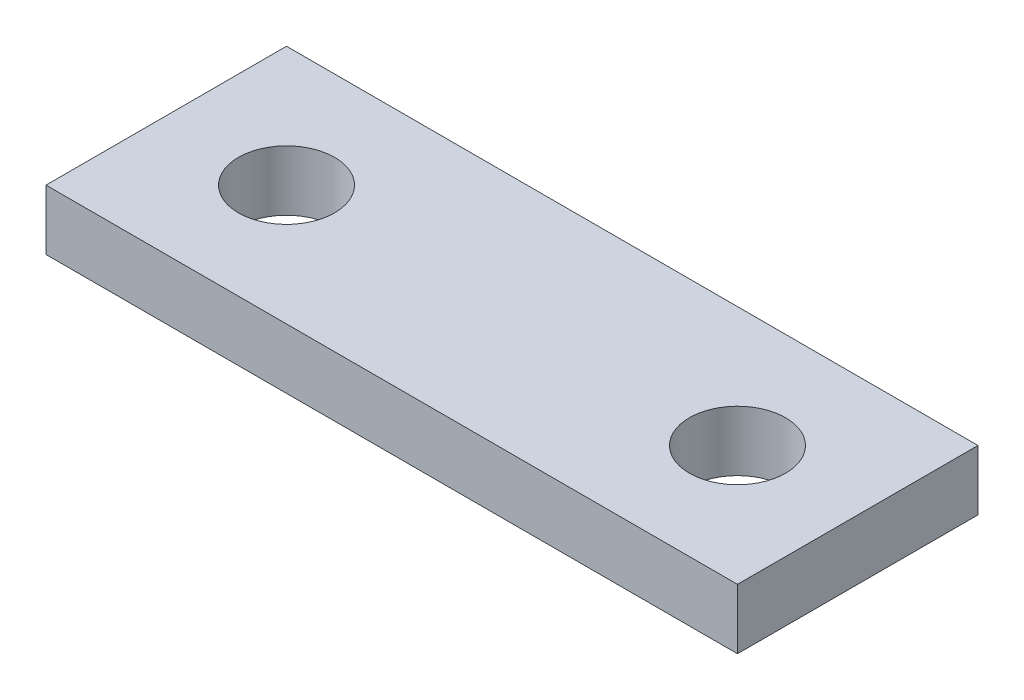
ISO-10303-21;
HEADER;
FILE_DESCRIPTION(('STEP AP214'),'2;1');
FILE_NAME('part.step','',(''),(''),'','','');
FILE_SCHEMA(('AUTOMOTIVE_DESIGN { 1 0 10303 214 1 1 1 1 }'));
ENDSEC;
DATA;
#1=APPLICATION_CONTEXT('core data for automotive mechanical design processes');
#2=APPLICATION_PROTOCOL_DEFINITION('international standard','automotive_design',2000,#1);
#3=PRODUCT_CONTEXT('',#1,'mechanical');
#4=PRODUCT('Part','Part','',(#3));
#5=PRODUCT_RELATED_PRODUCT_CATEGORY('part','',(#4));
#6=PRODUCT_DEFINITION_FORMATION('','',#4);
#7=PRODUCT_DEFINITION_CONTEXT('part definition',#1,'design');
#8=PRODUCT_DEFINITION('design','',#6,#7);
#9=PRODUCT_DEFINITION_SHAPE('','',#8);
#10=(LENGTH_UNIT() NAMED_UNIT(*) SI_UNIT(.MILLI.,.METRE.));
#11=(NAMED_UNIT(*) PLANE_ANGLE_UNIT() SI_UNIT($,.RADIAN.));
#12=(NAMED_UNIT(*) SI_UNIT($,.STERADIAN.) SOLID_ANGLE_UNIT());
#13=UNCERTAINTY_MEASURE_WITH_UNIT(LENGTH_MEASURE(1.E-05),#10,'distance_accuracy_value','');
#14=(GEOMETRIC_REPRESENTATION_CONTEXT(3) GLOBAL_UNCERTAINTY_ASSIGNED_CONTEXT((#13)) GLOBAL_UNIT_ASSIGNED_CONTEXT((#10,
#11,#12)) REPRESENTATION_CONTEXT('',''));
#15=CARTESIAN_POINT('',(0.,0.,0.));
#16=DIRECTION('',(0.,0.,1.));
#17=DIRECTION('',(1.,0.,0.));
#18=AXIS2_PLACEMENT_3D('',#15,#16,#17);
#19=CARTESIAN_POINT('',(-11.5,2.,4.));
#20=DIRECTION('',(1.,0.,0.));
#21=DIRECTION('',(0.,0.,-1.));
#22=AXIS2_PLACEMENT_3D('',#19,#20,#21);
#23=PLANE('',#22);
#24=DIRECTION('',(0.,0.,1.));
#25=VECTOR('',#24,1.);
#26=CARTESIAN_POINT('',(-11.5,0.,4.));
#27=LINE('',#26,#25);
#28=CARTESIAN_POINT('',(-11.5,0.,-4.));
#29=VERTEX_POINT('',#28);
#30=CARTESIAN_POINT('',(-11.5,0.,4.));
#31=VERTEX_POINT('',#30);
#32=EDGE_CURVE('E98',#29,#31,#27,.T.);
#33=ORIENTED_EDGE('',*,*,#32,.T.);
#34=DIRECTION('',(0.,-1.,0.));
#35=VECTOR('',#34,1.);
#36=CARTESIAN_POINT('',(-11.5,2.,4.));
#37=LINE('',#36,#35);
#38=CARTESIAN_POINT('',(-11.5,2.,4.));
#39=VERTEX_POINT('',#38);
#40=EDGE_CURVE('E11',#39,#31,#37,.T.);
#41=ORIENTED_EDGE('',*,*,#40,.F.);
#42=DIRECTION('',(0.,0.,1.));
#43=VECTOR('',#42,1.);
#44=CARTESIAN_POINT('',(-11.5,2.,4.));
#45=LINE('',#44,#43);
#46=CARTESIAN_POINT('',(-11.5,2.,-4.));
#47=VERTEX_POINT('',#46);
#48=EDGE_CURVE('E86',#47,#39,#45,.T.);
#49=ORIENTED_EDGE('',*,*,#48,.F.);
#50=DIRECTION('',(0.,-1.,0.));
#51=VECTOR('',#50,1.);
#52=CARTESIAN_POINT('',(-11.5,2.,-4.));
#53=LINE('',#52,#51);
#54=EDGE_CURVE('E94',#47,#29,#53,.T.);
#55=ORIENTED_EDGE('',*,*,#54,.T.);
#56=EDGE_LOOP('',(#33,#41,#49,#55));
#57=FACE_BOUND('',#56,.T.);
#58=ADVANCED_FACE('F35',(#57),#23,.F.);
#59=CARTESIAN_POINT('',(11.5,2.,4.));
#60=DIRECTION('',(0.,0.,-1.));
#61=DIRECTION('',(-1.,0.,0.));
#62=AXIS2_PLACEMENT_3D('',#59,#60,#61);
#63=PLANE('',#62);
#64=DIRECTION('',(1.,0.,0.));
#65=VECTOR('',#64,1.);
#66=CARTESIAN_POINT('',(11.5,0.,4.));
#67=LINE('',#66,#65);
#68=CARTESIAN_POINT('',(11.5,0.,4.));
#69=VERTEX_POINT('',#68);
#70=EDGE_CURVE('E90',#31,#69,#67,.T.);
#71=ORIENTED_EDGE('',*,*,#70,.T.);
#72=DIRECTION('',(0.,-1.,0.));
#73=VECTOR('',#72,1.);
#74=CARTESIAN_POINT('',(11.5,2.,4.));
#75=LINE('',#74,#73);
#76=CARTESIAN_POINT('',(11.5,2.,4.));
#77=VERTEX_POINT('',#76);
#78=EDGE_CURVE('E43',#77,#69,#75,.T.);
#79=ORIENTED_EDGE('',*,*,#78,.F.);
#80=DIRECTION('',(1.,0.,0.));
#81=VECTOR('',#80,1.);
#82=CARTESIAN_POINT('',(11.5,2.,4.));
#83=LINE('',#82,#81);
#84=EDGE_CURVE('E81',#39,#77,#83,.T.);
#85=ORIENTED_EDGE('',*,*,#84,.F.);
#86=ORIENTED_EDGE('',*,*,#40,.T.);
#87=EDGE_LOOP('',(#71,#79,#85,#86));
#88=FACE_BOUND('',#87,.T.);
#89=ADVANCED_FACE('F89',(#88),#63,.F.);
#90=CARTESIAN_POINT('',(11.5,2.,4.));
#91=DIRECTION('',(-1.,0.,0.));
#92=DIRECTION('',(0.,0.,1.));
#93=AXIS2_PLACEMENT_3D('',#90,#91,#92);
#94=PLANE('',#93);
#95=DIRECTION('',(0.,0.,-1.));
#96=VECTOR('',#95,1.);
#97=CARTESIAN_POINT('',(11.5,0.,4.));
#98=LINE('',#97,#96);
#99=CARTESIAN_POINT('',(11.5,0.,-4.));
#100=VERTEX_POINT('',#99);
#101=EDGE_CURVE('E68',#69,#100,#98,.T.);
#102=ORIENTED_EDGE('',*,*,#101,.T.);
#103=DIRECTION('',(0.,-1.,0.));
#104=VECTOR('',#103,1.);
#105=CARTESIAN_POINT('',(11.5,2.,-4.));
#106=LINE('',#105,#104);
#107=CARTESIAN_POINT('',(11.5,2.,-4.));
#108=VERTEX_POINT('',#107);
#109=EDGE_CURVE('E91',#108,#100,#106,.T.);
#110=ORIENTED_EDGE('',*,*,#109,.F.);
#111=DIRECTION('',(0.,0.,-1.));
#112=VECTOR('',#111,1.);
#113=CARTESIAN_POINT('',(11.5,2.,4.));
#114=LINE('',#113,#112);
#115=EDGE_CURVE('E84',#77,#108,#114,.T.);
#116=ORIENTED_EDGE('',*,*,#115,.F.);
#117=ORIENTED_EDGE('',*,*,#78,.T.);
#118=EDGE_LOOP('',(#102,#110,#116,#117));
#119=FACE_BOUND('',#118,.T.);
#120=ADVANCED_FACE('F92',(#119),#94,.F.);
#121=CARTESIAN_POINT('',(11.5,2.,-4.));
#122=DIRECTION('',(0.,0.,1.));
#123=DIRECTION('',(1.,0.,0.));
#124=AXIS2_PLACEMENT_3D('',#121,#122,#123);
#125=PLANE('',#124);
#126=DIRECTION('',(-1.,0.,0.));
#127=VECTOR('',#126,1.);
#128=CARTESIAN_POINT('',(11.5,0.,-4.));
#129=LINE('',#128,#127);
#130=EDGE_CURVE('E74',#100,#29,#129,.T.);
#131=ORIENTED_EDGE('',*,*,#130,.T.);
#132=ORIENTED_EDGE('',*,*,#54,.F.);
#133=DIRECTION('',(-1.,0.,0.));
#134=VECTOR('',#133,1.);
#135=CARTESIAN_POINT('',(11.5,2.,-4.));
#136=LINE('',#135,#134);
#137=EDGE_CURVE('E51',#108,#47,#136,.T.);
#138=ORIENTED_EDGE('',*,*,#137,.F.);
#139=ORIENTED_EDGE('',*,*,#109,.T.);
#140=EDGE_LOOP('',(#131,#132,#138,#139));
#141=FACE_BOUND('',#140,.T.);
#142=ADVANCED_FACE('F106',(#141),#125,.F.);
#143=CARTESIAN_POINT('',(0.,2.,0.));
#144=DIRECTION('',(0.,1.,0.));
#145=DIRECTION('',(0.,0.,1.));
#146=AXIS2_PLACEMENT_3D('',#143,#144,#145);
#147=PLANE('',#146);
#148=CARTESIAN_POINT('',(-7.5,2.,0.));
#149=DIRECTION('',(0.,1.,0.));
#150=DIRECTION('',(0.,0.,1.));
#151=AXIS2_PLACEMENT_3D('',#148,#149,#150);
#152=CIRCLE('',#151,1.6);
#153=CARTESIAN_POINT('',(-7.5,2.,1.6));
#154=VERTEX_POINT('',#153);
#155=EDGE_CURVE('E118',#154,#154,#152,.T.);
#156=ORIENTED_EDGE('',*,*,#155,.F.);
#157=EDGE_LOOP('',(#156));
#158=FACE_BOUND('',#157,.T.);
#159=CARTESIAN_POINT('',(7.5,2.,0.));
#160=DIRECTION('',(0.,1.,0.));
#161=DIRECTION('',(0.,0.,1.));
#162=AXIS2_PLACEMENT_3D('',#159,#160,#161);
#163=CIRCLE('',#162,1.6);
#164=CARTESIAN_POINT('',(7.5,2.,1.6));
#165=VERTEX_POINT('',#164);
#166=EDGE_CURVE('E112',#165,#165,#163,.T.);
#167=ORIENTED_EDGE('',*,*,#166,.F.);
#168=EDGE_LOOP('',(#167));
#169=FACE_BOUND('',#168,.T.);
#170=ORIENTED_EDGE('',*,*,#48,.T.);
#171=ORIENTED_EDGE('',*,*,#84,.T.);
#172=ORIENTED_EDGE('',*,*,#115,.T.);
#173=ORIENTED_EDGE('',*,*,#137,.T.);
#174=EDGE_LOOP('',(#170,#171,#172,#173));
#175=FACE_BOUND('',#174,.T.);
#176=ADVANCED_FACE('F82',(#158,#169,#175),#147,.T.);
#177=CARTESIAN_POINT('',(0.,0.,0.));
#178=DIRECTION('',(0.,1.,0.));
#179=DIRECTION('',(0.,0.,1.));
#180=AXIS2_PLACEMENT_3D('',#177,#178,#179);
#181=PLANE('',#180);
#182=CARTESIAN_POINT('',(-7.5,0.,0.));
#183=DIRECTION('',(0.,1.,0.));
#184=DIRECTION('',(0.,0.,1.));
#185=AXIS2_PLACEMENT_3D('',#182,#183,#184);
#186=CIRCLE('',#185,1.6);
#187=CARTESIAN_POINT('',(-7.5,0.,1.6));
#188=VERTEX_POINT('',#187);
#189=EDGE_CURVE('E101',#188,#188,#186,.T.);
#190=ORIENTED_EDGE('',*,*,#189,.T.);
#191=EDGE_LOOP('',(#190));
#192=FACE_BOUND('',#191,.T.);
#193=CARTESIAN_POINT('',(7.5,0.,0.));
#194=DIRECTION('',(0.,1.,0.));
#195=DIRECTION('',(0.,0.,1.));
#196=AXIS2_PLACEMENT_3D('',#193,#194,#195);
#197=CIRCLE('',#196,1.6);
#198=CARTESIAN_POINT('',(7.5,0.,1.6));
#199=VERTEX_POINT('',#198);
#200=EDGE_CURVE('E115',#199,#199,#197,.T.);
#201=ORIENTED_EDGE('',*,*,#200,.T.);
#202=EDGE_LOOP('',(#201));
#203=FACE_BOUND('',#202,.T.);
#204=ORIENTED_EDGE('',*,*,#32,.F.);
#205=ORIENTED_EDGE('',*,*,#130,.F.);
#206=ORIENTED_EDGE('',*,*,#101,.F.);
#207=ORIENTED_EDGE('',*,*,#70,.F.);
#208=EDGE_LOOP('',(#204,#205,#206,#207));
#209=FACE_BOUND('',#208,.T.);
#210=ADVANCED_FACE('F109',(#192,#203,#209),#181,.F.);
#211=CARTESIAN_POINT('',(7.5,0.,0.));
#212=DIRECTION('',(0.,1.,0.));
#213=DIRECTION('',(0.,0.,1.));
#214=AXIS2_PLACEMENT_3D('',#211,#212,#213);
#215=CYLINDRICAL_SURFACE('',#214,1.6);
#216=ORIENTED_EDGE('',*,*,#200,.F.);
#217=EDGE_LOOP('',(#216));
#218=FACE_BOUND('',#217,.T.);
#219=ORIENTED_EDGE('',*,*,#166,.T.);
#220=EDGE_LOOP('',(#219));
#221=FACE_BOUND('',#220,.T.);
#222=ADVANCED_FACE('F129',(#218,#221),#215,.F.);
#223=CARTESIAN_POINT('',(-7.5,0.,0.));
#224=DIRECTION('',(0.,1.,0.));
#225=DIRECTION('',(0.,0.,1.));
#226=AXIS2_PLACEMENT_3D('',#223,#224,#225);
#227=CYLINDRICAL_SURFACE('',#226,1.6);
#228=ORIENTED_EDGE('',*,*,#189,.F.);
#229=EDGE_LOOP('',(#228));
#230=FACE_BOUND('',#229,.T.);
#231=ORIENTED_EDGE('',*,*,#155,.T.);
#232=EDGE_LOOP('',(#231));
#233=FACE_BOUND('',#232,.T.);
#234=ADVANCED_FACE('F126',(#230,#233),#227,.F.);
#235=CLOSED_SHELL('',(#58,#89,#120,#142,#176,#210,#222,#234));
#236=MANIFOLD_SOLID_BREP('B2',#235);
#237=ADVANCED_BREP_SHAPE_REPRESENTATION('',(#18,#236),#14);
#238=SHAPE_DEFINITION_REPRESENTATION(#9,#237);
ENDSEC;
END-ISO-10303-21;
